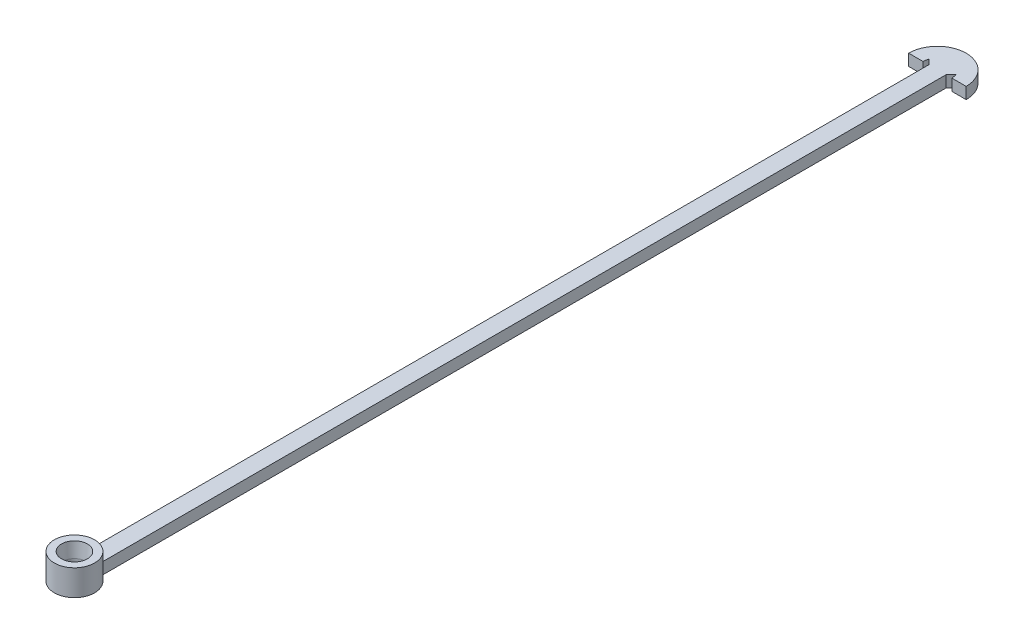
ISO-10303-21;
HEADER;
FILE_DESCRIPTION(('STEP AP214'),'2;1');
FILE_NAME('part.step','',(''),(''),'','','');
FILE_SCHEMA(('AUTOMOTIVE_DESIGN { 1 0 10303 214 1 1 1 1 }'));
ENDSEC;
DATA;
#1=APPLICATION_CONTEXT('core data for automotive mechanical design processes');
#2=APPLICATION_PROTOCOL_DEFINITION('international standard','automotive_design',2000,#1);
#3=PRODUCT_CONTEXT('',#1,'mechanical');
#4=PRODUCT('Part','Part','',(#3));
#5=PRODUCT_RELATED_PRODUCT_CATEGORY('part','',(#4));
#6=PRODUCT_DEFINITION_FORMATION('','',#4);
#7=PRODUCT_DEFINITION_CONTEXT('part definition',#1,'design');
#8=PRODUCT_DEFINITION('design','',#6,#7);
#9=PRODUCT_DEFINITION_SHAPE('','',#8);
#10=(LENGTH_UNIT() NAMED_UNIT(*) SI_UNIT(.MILLI.,.METRE.));
#11=(NAMED_UNIT(*) PLANE_ANGLE_UNIT() SI_UNIT($,.RADIAN.));
#12=(NAMED_UNIT(*) SI_UNIT($,.STERADIAN.) SOLID_ANGLE_UNIT());
#13=UNCERTAINTY_MEASURE_WITH_UNIT(LENGTH_MEASURE(1.E-05),#10,'distance_accuracy_value','');
#14=(GEOMETRIC_REPRESENTATION_CONTEXT(3) GLOBAL_UNCERTAINTY_ASSIGNED_CONTEXT((#13)) GLOBAL_UNIT_ASSIGNED_CONTEXT((#10,
#11,#12)) REPRESENTATION_CONTEXT('',''));
#15=CARTESIAN_POINT('',(0.,0.,0.));
#16=DIRECTION('',(0.,0.,1.));
#17=DIRECTION('',(1.,0.,0.));
#18=AXIS2_PLACEMENT_3D('',#15,#16,#17);
#19=CARTESIAN_POINT('',(0.,4.,-300.));
#20=DIRECTION('',(0.,1.,0.));
#21=DIRECTION('',(0.,0.,1.));
#22=AXIS2_PLACEMENT_3D('',#19,#20,#21);
#23=PLANE('',#22);
#24=CARTESIAN_POINT('',(0.,4.,0.));
#25=DIRECTION('',(0.,1.,0.));
#26=DIRECTION('',(0.,0.,1.));
#27=AXIS2_PLACEMENT_3D('',#24,#25,#26);
#28=CIRCLE('',#27,7.);
#29=CARTESIAN_POINT('',(2.99999999999999,4.,-6.32455532033677));
#30=VERTEX_POINT('',#29);
#31=CARTESIAN_POINT('',(-2.99999999999999,4.,-6.32455532033677));
#32=VERTEX_POINT('',#31);
#33=EDGE_CURVE('E214',#30,#32,#28,.T.);
#34=ORIENTED_EDGE('',*,*,#33,.F.);
#35=DIRECTION('',(0.,0.,-1.));
#36=VECTOR('',#35,1.);
#37=CARTESIAN_POINT('',(3.00000000000002,4.,-300.));
#38=LINE('',#37,#36);
#39=CARTESIAN_POINT('',(3.00000000000002,4.,-300.));
#40=VERTEX_POINT('',#39);
#41=EDGE_CURVE('E200',#30,#40,#38,.T.);
#42=ORIENTED_EDGE('',*,*,#41,.T.);
#43=DIRECTION('',(0.707106781186534,0.,-0.707106781186561));
#44=VECTOR('',#43,1.);
#45=CARTESIAN_POINT('',(3.00000000000002,4.,-300.));
#46=LINE('',#45,#44);
#47=CARTESIAN_POINT('',(4.70156211871643,4.,-301.701562118716));
#48=VERTEX_POINT('',#47);
#49=EDGE_CURVE('E202',#40,#48,#46,.T.);
#50=ORIENTED_EDGE('',*,*,#49,.T.);
#51=CARTESIAN_POINT('',(0.,4.,-300.));
#52=DIRECTION('',(0.,-1.,0.));
#53=DIRECTION('',(0.,0.,1.));
#54=AXIS2_PLACEMENT_3D('',#51,#52,#53);
#55=CIRCLE('',#54,5.00000000000002);
#56=CARTESIAN_POINT('',(5.00000000000002,4.,-300.));
#57=VERTEX_POINT('',#56);
#58=EDGE_CURVE('E125',#48,#57,#55,.T.);
#59=ORIENTED_EDGE('',*,*,#58,.T.);
#60=DIRECTION('',(1.,0.,0.));
#61=VECTOR('',#60,1.);
#62=CARTESIAN_POINT('',(5.00000000000002,4.,-300.));
#63=LINE('',#62,#61);
#64=CARTESIAN_POINT('',(10.,4.,-300.));
#65=VERTEX_POINT('',#64);
#66=EDGE_CURVE('E119',#57,#65,#63,.T.);
#67=ORIENTED_EDGE('',*,*,#66,.T.);
#68=CARTESIAN_POINT('',(0.,4.,-300.));
#69=DIRECTION('',(0.,1.,0.));
#70=DIRECTION('',(0.,0.,1.));
#71=AXIS2_PLACEMENT_3D('',#68,#69,#70);
#72=CIRCLE('',#71,10.);
#73=CARTESIAN_POINT('',(-10.,4.,-300.));
#74=VERTEX_POINT('',#73);
#75=EDGE_CURVE('E123',#65,#74,#72,.T.);
#76=ORIENTED_EDGE('',*,*,#75,.T.);
#77=DIRECTION('',(1.,0.,0.));
#78=VECTOR('',#77,1.);
#79=CARTESIAN_POINT('',(-5.00000000000002,4.,-300.));
#80=LINE('',#79,#78);
#81=CARTESIAN_POINT('',(-5.00000000000002,4.,-300.));
#82=VERTEX_POINT('',#81);
#83=EDGE_CURVE('E52',#74,#82,#80,.T.);
#84=ORIENTED_EDGE('',*,*,#83,.T.);
#85=CARTESIAN_POINT('',(0.,4.,-300.));
#86=DIRECTION('',(0.,-1.,0.));
#87=DIRECTION('',(0.,0.,1.));
#88=AXIS2_PLACEMENT_3D('',#85,#86,#87);
#89=CIRCLE('',#88,5.00000000000001);
#90=CARTESIAN_POINT('',(-4.70156211871641,4.,-301.701562118716));
#91=VERTEX_POINT('',#90);
#92=EDGE_CURVE('E162',#82,#91,#89,.T.);
#93=ORIENTED_EDGE('',*,*,#92,.T.);
#94=DIRECTION('',(0.707106781186529,0.,0.707106781186566));
#95=VECTOR('',#94,1.);
#96=CARTESIAN_POINT('',(-3.00000000000002,4.,-300.));
#97=LINE('',#96,#95);
#98=CARTESIAN_POINT('',(-3.00000000000002,4.,-300.));
#99=VERTEX_POINT('',#98);
#100=EDGE_CURVE('E102',#91,#99,#97,.T.);
#101=ORIENTED_EDGE('',*,*,#100,.T.);
#102=DIRECTION('',(0.,0.,1.));
#103=VECTOR('',#102,1.);
#104=CARTESIAN_POINT('',(-3.00000000000002,4.,-300.));
#105=LINE('',#104,#103);
#106=EDGE_CURVE('E183',#99,#32,#105,.T.);
#107=ORIENTED_EDGE('',*,*,#106,.T.);
#108=EDGE_LOOP('',(#34,#42,#50,#59,#67,#76,#84,#93,#101,#107));
#109=FACE_BOUND('',#108,.T.);
#110=ADVANCED_FACE('F35',(#109),#23,.T.);
#111=CARTESIAN_POINT('',(0.,0.,-300.));
#112=DIRECTION('',(0.,1.,0.));
#113=DIRECTION('',(0.,0.,1.));
#114=AXIS2_PLACEMENT_3D('',#111,#112,#113);
#115=PLANE('',#114);
#116=CARTESIAN_POINT('',(0.,0.,-300.));
#117=DIRECTION('',(0.,-1.,0.));
#118=DIRECTION('',(0.,0.,1.));
#119=AXIS2_PLACEMENT_3D('',#116,#117,#118);
#120=CIRCLE('',#119,5.00000000000001);
#121=CARTESIAN_POINT('',(-5.00000000000002,0.,-300.));
#122=VERTEX_POINT('',#121);
#123=CARTESIAN_POINT('',(-4.70156211871641,0.,-301.701562118716));
#124=VERTEX_POINT('',#123);
#125=EDGE_CURVE('E143',#122,#124,#120,.T.);
#126=ORIENTED_EDGE('',*,*,#125,.F.);
#127=DIRECTION('',(1.,0.,0.));
#128=VECTOR('',#127,1.);
#129=CARTESIAN_POINT('',(-5.00000000000002,0.,-300.));
#130=LINE('',#129,#128);
#131=CARTESIAN_POINT('',(-10.,0.,-300.));
#132=VERTEX_POINT('',#131);
#133=EDGE_CURVE('E94',#132,#122,#130,.T.);
#134=ORIENTED_EDGE('',*,*,#133,.F.);
#135=CARTESIAN_POINT('',(0.,0.,-300.));
#136=DIRECTION('',(0.,1.,0.));
#137=DIRECTION('',(0.,0.,1.));
#138=AXIS2_PLACEMENT_3D('',#135,#136,#137);
#139=CIRCLE('',#138,10.);
#140=CARTESIAN_POINT('',(10.,0.,-300.));
#141=VERTEX_POINT('',#140);
#142=EDGE_CURVE('E88',#141,#132,#139,.T.);
#143=ORIENTED_EDGE('',*,*,#142,.F.);
#144=DIRECTION('',(1.,0.,0.));
#145=VECTOR('',#144,1.);
#146=CARTESIAN_POINT('',(5.00000000000002,0.,-300.));
#147=LINE('',#146,#145);
#148=CARTESIAN_POINT('',(5.00000000000002,0.,-300.));
#149=VERTEX_POINT('',#148);
#150=EDGE_CURVE('E133',#149,#141,#147,.T.);
#151=ORIENTED_EDGE('',*,*,#150,.F.);
#152=CARTESIAN_POINT('',(0.,0.,-300.));
#153=DIRECTION('',(0.,-1.,0.));
#154=DIRECTION('',(0.,0.,1.));
#155=AXIS2_PLACEMENT_3D('',#152,#153,#154);
#156=CIRCLE('',#155,5.00000000000002);
#157=CARTESIAN_POINT('',(4.70156211871643,0.,-301.701562118716));
#158=VERTEX_POINT('',#157);
#159=EDGE_CURVE('E157',#158,#149,#156,.T.);
#160=ORIENTED_EDGE('',*,*,#159,.F.);
#161=DIRECTION('',(0.707106781186534,0.,-0.707106781186561));
#162=VECTOR('',#161,1.);
#163=CARTESIAN_POINT('',(3.00000000000002,0.,-300.));
#164=LINE('',#163,#162);
#165=CARTESIAN_POINT('',(3.00000000000002,0.,-300.));
#166=VERTEX_POINT('',#165);
#167=EDGE_CURVE('E155',#166,#158,#164,.T.);
#168=ORIENTED_EDGE('',*,*,#167,.F.);
#169=DIRECTION('',(0.,0.,-1.));
#170=VECTOR('',#169,1.);
#171=CARTESIAN_POINT('',(3.00000000000002,0.,-300.));
#172=LINE('',#171,#170);
#173=CARTESIAN_POINT('',(2.99999999999999,0.,-6.32455532033677));
#174=VERTEX_POINT('',#173);
#175=EDGE_CURVE('E153',#174,#166,#172,.T.);
#176=ORIENTED_EDGE('',*,*,#175,.F.);
#177=CARTESIAN_POINT('',(0.,0.,0.));
#178=DIRECTION('',(0.,1.,0.));
#179=DIRECTION('',(0.,0.,1.));
#180=AXIS2_PLACEMENT_3D('',#177,#178,#179);
#181=CIRCLE('',#180,7.);
#182=CARTESIAN_POINT('',(-2.99999999999999,0.,-6.32455532033677));
#183=VERTEX_POINT('',#182);
#184=EDGE_CURVE('E151',#183,#174,#181,.T.);
#185=ORIENTED_EDGE('',*,*,#184,.F.);
#186=DIRECTION('',(0.,0.,1.));
#187=VECTOR('',#186,1.);
#188=CARTESIAN_POINT('',(-3.00000000000002,0.,-300.));
#189=LINE('',#188,#187);
#190=CARTESIAN_POINT('',(-3.00000000000002,0.,-300.));
#191=VERTEX_POINT('',#190);
#192=EDGE_CURVE('E149',#191,#183,#189,.T.);
#193=ORIENTED_EDGE('',*,*,#192,.F.);
#194=DIRECTION('',(0.707106781186529,0.,0.707106781186566));
#195=VECTOR('',#194,1.);
#196=CARTESIAN_POINT('',(-3.00000000000002,0.,-300.));
#197=LINE('',#196,#195);
#198=EDGE_CURVE('E146',#124,#191,#197,.T.);
#199=ORIENTED_EDGE('',*,*,#198,.F.);
#200=EDGE_LOOP('',(#126,#134,#143,#151,#160,#168,#176,#185,#193,#199));
#201=FACE_BOUND('',#200,.T.);
#202=CARTESIAN_POINT('',(0.,0.,0.));
#203=DIRECTION('',(0.,1.,0.));
#204=DIRECTION('',(0.,0.,1.));
#205=AXIS2_PLACEMENT_3D('',#202,#203,#204);
#206=CIRCLE('',#205,4.);
#207=CARTESIAN_POINT('',(0.,0.,4.));
#208=VERTEX_POINT('',#207);
#209=EDGE_CURVE('E147',#208,#208,#206,.T.);
#210=ORIENTED_EDGE('',*,*,#209,.T.);
#211=EDGE_LOOP('',(#210));
#212=FACE_BOUND('',#211,.T.);
#213=ADVANCED_FACE('F187',(#201,#212),#115,.F.);
#214=CARTESIAN_POINT('',(0.,4.,-300.));
#215=DIRECTION('',(0.,-1.,0.));
#216=DIRECTION('',(0.,0.,-1.));
#217=AXIS2_PLACEMENT_3D('',#214,#215,#216);
#218=CYLINDRICAL_SURFACE('',#217,5.00000000000001);
#219=ORIENTED_EDGE('',*,*,#125,.T.);
#220=DIRECTION('',(0.,-1.,0.));
#221=VECTOR('',#220,1.);
#222=CARTESIAN_POINT('',(-4.70156211871641,4.,-301.701562118716));
#223=LINE('',#222,#221);
#224=EDGE_CURVE('E12',#91,#124,#223,.T.);
#225=ORIENTED_EDGE('',*,*,#224,.F.);
#226=ORIENTED_EDGE('',*,*,#92,.F.);
#227=DIRECTION('',(0.,-1.,0.));
#228=VECTOR('',#227,1.);
#229=CARTESIAN_POINT('',(-5.00000000000002,4.,-300.));
#230=LINE('',#229,#228);
#231=EDGE_CURVE('E139',#82,#122,#230,.T.);
#232=ORIENTED_EDGE('',*,*,#231,.T.);
#233=EDGE_LOOP('',(#219,#225,#226,#232));
#234=FACE_BOUND('',#233,.T.);
#235=ADVANCED_FACE('F37',(#234),#218,.F.);
#236=CARTESIAN_POINT('',(-3.00000000000002,4.,-300.));
#237=DIRECTION('',(0.707106781186566,0.,-0.707106781186529));
#238=DIRECTION('',(-0.707106781186529,0.,-0.707106781186566));
#239=AXIS2_PLACEMENT_3D('',#236,#237,#238);
#240=PLANE('',#239);
#241=ORIENTED_EDGE('',*,*,#198,.T.);
#242=DIRECTION('',(0.,-1.,0.));
#243=VECTOR('',#242,1.);
#244=CARTESIAN_POINT('',(-3.00000000000002,4.,-300.));
#245=LINE('',#244,#243);
#246=EDGE_CURVE('E44',#99,#191,#245,.T.);
#247=ORIENTED_EDGE('',*,*,#246,.F.);
#248=ORIENTED_EDGE('',*,*,#100,.F.);
#249=ORIENTED_EDGE('',*,*,#224,.T.);
#250=EDGE_LOOP('',(#241,#247,#248,#249));
#251=FACE_BOUND('',#250,.T.);
#252=ADVANCED_FACE('F240',(#251),#240,.F.);
#253=CARTESIAN_POINT('',(-3.00000000000002,4.,-300.));
#254=DIRECTION('',(1.,0.,0.));
#255=DIRECTION('',(0.,0.,-1.));
#256=AXIS2_PLACEMENT_3D('',#253,#254,#255);
#257=PLANE('',#256);
#258=ORIENTED_EDGE('',*,*,#192,.T.);
#259=DIRECTION('',(0.,-1.,0.));
#260=VECTOR('',#259,1.);
#261=CARTESIAN_POINT('',(-2.99999999999999,4.,-6.32455532033677));
#262=LINE('',#261,#260);
#263=EDGE_CURVE('E175',#32,#183,#262,.T.);
#264=ORIENTED_EDGE('',*,*,#263,.F.);
#265=ORIENTED_EDGE('',*,*,#106,.F.);
#266=ORIENTED_EDGE('',*,*,#246,.T.);
#267=EDGE_LOOP('',(#258,#264,#265,#266));
#268=FACE_BOUND('',#267,.T.);
#269=ADVANCED_FACE('F181',(#268),#257,.F.);
#270=CARTESIAN_POINT('',(0.,4.,0.));
#271=DIRECTION('',(0.,-1.,0.));
#272=DIRECTION('',(0.,0.,-1.));
#273=AXIS2_PLACEMENT_3D('',#270,#271,#272);
#274=CYLINDRICAL_SURFACE('',#273,7.);
#275=ORIENTED_EDGE('',*,*,#184,.T.);
#276=DIRECTION('',(0.,-1.,0.));
#277=VECTOR('',#276,1.);
#278=CARTESIAN_POINT('',(2.99999999999999,4.,-6.32455532033677));
#279=LINE('',#278,#277);
#280=EDGE_CURVE('E172',#30,#174,#279,.T.);
#281=ORIENTED_EDGE('',*,*,#280,.F.);
#282=ORIENTED_EDGE('',*,*,#33,.T.);
#283=ORIENTED_EDGE('',*,*,#263,.T.);
#284=EDGE_LOOP('',(#275,#281,#282,#283));
#285=FACE_BOUND('',#284,.T.);
#286=CARTESIAN_POINT('',(0.,9.,0.));
#287=DIRECTION('',(0.,1.,0.));
#288=DIRECTION('',(0.,0.,1.));
#289=AXIS2_PLACEMENT_3D('',#286,#287,#288);
#290=CIRCLE('',#289,7.);
#291=CARTESIAN_POINT('',(0.,9.,7.));
#292=VERTEX_POINT('',#291);
#293=EDGE_CURVE('E211',#292,#292,#290,.T.);
#294=ORIENTED_EDGE('',*,*,#293,.F.);
#295=EDGE_LOOP('',(#294));
#296=FACE_BOUND('',#295,.T.);
#297=ADVANCED_FACE('F193',(#285,#296),#274,.T.);
#298=CARTESIAN_POINT('',(3.00000000000002,4.,-300.));
#299=DIRECTION('',(-1.,0.,0.));
#300=DIRECTION('',(0.,0.,1.));
#301=AXIS2_PLACEMENT_3D('',#298,#299,#300);
#302=PLANE('',#301);
#303=ORIENTED_EDGE('',*,*,#175,.T.);
#304=DIRECTION('',(0.,-1.,0.));
#305=VECTOR('',#304,1.);
#306=CARTESIAN_POINT('',(3.00000000000002,4.,-300.));
#307=LINE('',#306,#305);
#308=EDGE_CURVE('E169',#40,#166,#307,.T.);
#309=ORIENTED_EDGE('',*,*,#308,.F.);
#310=ORIENTED_EDGE('',*,*,#41,.F.);
#311=ORIENTED_EDGE('',*,*,#280,.T.);
#312=EDGE_LOOP('',(#303,#309,#310,#311));
#313=FACE_BOUND('',#312,.T.);
#314=ADVANCED_FACE('F198',(#313),#302,.F.);
#315=CARTESIAN_POINT('',(3.00000000000002,4.,-300.));
#316=DIRECTION('',(-0.707106781186561,0.,-0.707106781186534));
#317=DIRECTION('',(-0.707106781186534,0.,0.707106781186561));
#318=AXIS2_PLACEMENT_3D('',#315,#316,#317);
#319=PLANE('',#318);
#320=ORIENTED_EDGE('',*,*,#167,.T.);
#321=DIRECTION('',(0.,-1.,0.));
#322=VECTOR('',#321,1.);
#323=CARTESIAN_POINT('',(4.70156211871643,4.,-301.701562118716));
#324=LINE('',#323,#322);
#325=EDGE_CURVE('E166',#48,#158,#324,.T.);
#326=ORIENTED_EDGE('',*,*,#325,.F.);
#327=ORIENTED_EDGE('',*,*,#49,.F.);
#328=ORIENTED_EDGE('',*,*,#308,.T.);
#329=EDGE_LOOP('',(#320,#326,#327,#328));
#330=FACE_BOUND('',#329,.T.);
#331=ADVANCED_FACE('F238',(#330),#319,.F.);
#332=CARTESIAN_POINT('',(0.,4.,-300.));
#333=DIRECTION('',(0.,-1.,0.));
#334=DIRECTION('',(0.,0.,-1.));
#335=AXIS2_PLACEMENT_3D('',#332,#333,#334);
#336=CYLINDRICAL_SURFACE('',#335,5.00000000000002);
#337=ORIENTED_EDGE('',*,*,#159,.T.);
#338=DIRECTION('',(0.,-1.,0.));
#339=VECTOR('',#338,1.);
#340=CARTESIAN_POINT('',(5.00000000000002,4.,-300.));
#341=LINE('',#340,#339);
#342=EDGE_CURVE('E134',#57,#149,#341,.T.);
#343=ORIENTED_EDGE('',*,*,#342,.F.);
#344=ORIENTED_EDGE('',*,*,#58,.F.);
#345=ORIENTED_EDGE('',*,*,#325,.T.);
#346=EDGE_LOOP('',(#337,#343,#344,#345));
#347=FACE_BOUND('',#346,.T.);
#348=ADVANCED_FACE('F257',(#347),#336,.F.);
#349=CARTESIAN_POINT('',(5.00000000000002,4.,-300.));
#350=DIRECTION('',(0.,0.,-1.));
#351=DIRECTION('',(-1.,0.,0.));
#352=AXIS2_PLACEMENT_3D('',#349,#350,#351);
#353=PLANE('',#352);
#354=ORIENTED_EDGE('',*,*,#150,.T.);
#355=DIRECTION('',(0.,-1.,0.));
#356=VECTOR('',#355,1.);
#357=CARTESIAN_POINT('',(10.,4.,-300.));
#358=LINE('',#357,#356);
#359=EDGE_CURVE('E130',#65,#141,#358,.T.);
#360=ORIENTED_EDGE('',*,*,#359,.F.);
#361=ORIENTED_EDGE('',*,*,#66,.F.);
#362=ORIENTED_EDGE('',*,*,#342,.T.);
#363=EDGE_LOOP('',(#354,#360,#361,#362));
#364=FACE_BOUND('',#363,.T.);
#365=ADVANCED_FACE('F131',(#364),#353,.F.);
#366=CARTESIAN_POINT('',(0.,4.,-300.));
#367=DIRECTION('',(0.,-1.,0.));
#368=DIRECTION('',(0.,0.,-1.));
#369=AXIS2_PLACEMENT_3D('',#366,#367,#368);
#370=CYLINDRICAL_SURFACE('',#369,10.);
#371=ORIENTED_EDGE('',*,*,#142,.T.);
#372=DIRECTION('',(0.,-1.,0.));
#373=VECTOR('',#372,1.);
#374=CARTESIAN_POINT('',(-10.,4.,-300.));
#375=LINE('',#374,#373);
#376=EDGE_CURVE('E135',#74,#132,#375,.T.);
#377=ORIENTED_EDGE('',*,*,#376,.F.);
#378=ORIENTED_EDGE('',*,*,#75,.F.);
#379=ORIENTED_EDGE('',*,*,#359,.T.);
#380=EDGE_LOOP('',(#371,#377,#378,#379));
#381=FACE_BOUND('',#380,.T.);
#382=ADVANCED_FACE('F137',(#381),#370,.T.);
#383=CARTESIAN_POINT('',(-5.00000000000002,4.,-300.));
#384=DIRECTION('',(0.,0.,-1.));
#385=DIRECTION('',(-1.,0.,0.));
#386=AXIS2_PLACEMENT_3D('',#383,#384,#385);
#387=PLANE('',#386);
#388=ORIENTED_EDGE('',*,*,#133,.T.);
#389=ORIENTED_EDGE('',*,*,#231,.F.);
#390=ORIENTED_EDGE('',*,*,#83,.F.);
#391=ORIENTED_EDGE('',*,*,#376,.T.);
#392=EDGE_LOOP('',(#388,#389,#390,#391));
#393=FACE_BOUND('',#392,.T.);
#394=ADVANCED_FACE('F250',(#393),#387,.F.);
#395=CARTESIAN_POINT('',(0.,4.,0.));
#396=DIRECTION('',(0.,-1.,0.));
#397=DIRECTION('',(0.,0.,-1.));
#398=AXIS2_PLACEMENT_3D('',#395,#396,#397);
#399=CYLINDRICAL_SURFACE('',#398,4.);
#400=CARTESIAN_POINT('',(0.,4.,0.));
#401=DIRECTION('',(0.,1.,0.));
#402=DIRECTION('',(0.,0.,1.));
#403=AXIS2_PLACEMENT_3D('',#400,#401,#402);
#404=CIRCLE('',#403,4.);
#405=CARTESIAN_POINT('',(0.,4.,4.));
#406=VERTEX_POINT('',#405);
#407=EDGE_CURVE('E216',#406,#406,#404,.T.);
#408=ORIENTED_EDGE('',*,*,#407,.T.);
#409=EDGE_LOOP('',(#408));
#410=FACE_BOUND('',#409,.T.);
#411=ORIENTED_EDGE('',*,*,#209,.F.);
#412=EDGE_LOOP('',(#411));
#413=FACE_BOUND('',#412,.T.);
#414=ADVANCED_FACE('F229',(#410,#413),#399,.F.);
#415=CARTESIAN_POINT('',(0.,9.,0.));
#416=DIRECTION('',(0.,1.,0.));
#417=DIRECTION('',(0.,0.,1.));
#418=AXIS2_PLACEMENT_3D('',#415,#416,#417);
#419=PLANE('',#418);
#420=CARTESIAN_POINT('',(0.,9.,0.));
#421=DIRECTION('',(0.,1.,0.));
#422=DIRECTION('',(0.,0.,1.));
#423=AXIS2_PLACEMENT_3D('',#420,#421,#422);
#424=CIRCLE('',#423,4.5);
#425=CARTESIAN_POINT('',(0.,9.,4.5));
#426=VERTEX_POINT('',#425);
#427=EDGE_CURVE('E219',#426,#426,#424,.T.);
#428=ORIENTED_EDGE('',*,*,#427,.F.);
#429=EDGE_LOOP('',(#428));
#430=FACE_BOUND('',#429,.T.);
#431=ORIENTED_EDGE('',*,*,#293,.T.);
#432=EDGE_LOOP('',(#431));
#433=FACE_BOUND('',#432,.T.);
#434=ADVANCED_FACE('F226',(#430,#433),#419,.T.);
#435=CARTESIAN_POINT('',(0.,4.,0.));
#436=DIRECTION('',(0.,1.,0.));
#437=DIRECTION('',(0.,0.,1.));
#438=AXIS2_PLACEMENT_3D('',#435,#436,#437);
#439=CONICAL_SURFACE('',#438,4.,0.0996686524911623);
#440=ORIENTED_EDGE('',*,*,#427,.T.);
#441=EDGE_LOOP('',(#440));
#442=FACE_BOUND('',#441,.T.);
#443=ORIENTED_EDGE('',*,*,#407,.F.);
#444=EDGE_LOOP('',(#443));
#445=FACE_BOUND('',#444,.T.);
#446=ADVANCED_FACE('F223',(#442,#445),#439,.F.);
#447=CLOSED_SHELL('',(#110,#213,#235,#252,#269,#297,#314,#331,#348,#365,#382,#394,#414,#434,#446));
#448=MANIFOLD_SOLID_BREP('B2',#447);
#449=ADVANCED_BREP_SHAPE_REPRESENTATION('',(#18,#448),#14);
#450=SHAPE_DEFINITION_REPRESENTATION(#9,#449);
ENDSEC;
END-ISO-10303-21;
